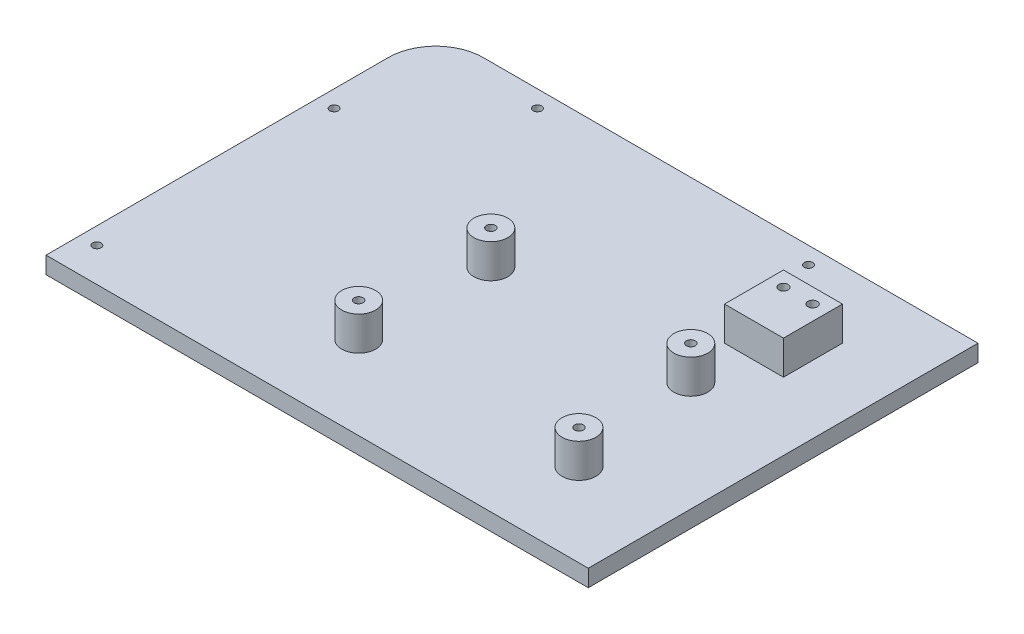
ISO-10303-21;
HEADER;
FILE_DESCRIPTION(('STEP AP214'),'2;1');
FILE_NAME('part.step','',(''),(''),'','','');
FILE_SCHEMA(('AUTOMOTIVE_DESIGN { 1 0 10303 214 1 1 1 1 }'));
ENDSEC;
DATA;
#1=APPLICATION_CONTEXT('core data for automotive mechanical design processes');
#2=APPLICATION_PROTOCOL_DEFINITION('international standard','automotive_design',2000,#1);
#3=PRODUCT_CONTEXT('',#1,'mechanical');
#4=PRODUCT('Part','Part','',(#3));
#5=PRODUCT_RELATED_PRODUCT_CATEGORY('part','',(#4));
#6=PRODUCT_DEFINITION_FORMATION('','',#4);
#7=PRODUCT_DEFINITION_CONTEXT('part definition',#1,'design');
#8=PRODUCT_DEFINITION('design','',#6,#7);
#9=PRODUCT_DEFINITION_SHAPE('','',#8);
#10=(LENGTH_UNIT() NAMED_UNIT(*) SI_UNIT(.MILLI.,.METRE.));
#11=(NAMED_UNIT(*) PLANE_ANGLE_UNIT() SI_UNIT($,.RADIAN.));
#12=(NAMED_UNIT(*) SI_UNIT($,.STERADIAN.) SOLID_ANGLE_UNIT());
#13=UNCERTAINTY_MEASURE_WITH_UNIT(LENGTH_MEASURE(1.E-05),#10,'distance_accuracy_value','');
#14=(GEOMETRIC_REPRESENTATION_CONTEXT(3) GLOBAL_UNCERTAINTY_ASSIGNED_CONTEXT((#13)) GLOBAL_UNIT_ASSIGNED_CONTEXT((#10,
#11,#12)) REPRESENTATION_CONTEXT('',''));
#15=CARTESIAN_POINT('',(0.,0.,0.));
#16=DIRECTION('',(0.,0.,1.));
#17=DIRECTION('',(1.,0.,0.));
#18=AXIS2_PLACEMENT_3D('',#15,#16,#17);
#19=CARTESIAN_POINT('',(17.78,6.35,-128.27));
#20=DIRECTION('',(0.,1.,0.));
#21=DIRECTION('',(0.,0.,1.));
#22=AXIS2_PLACEMENT_3D('',#19,#20,#21);
#23=PLANE('',#22);
#24=CARTESIAN_POINT('',(85.9336863697758,6.35,-31.242));
#25=DIRECTION('',(0.,1.,0.));
#26=DIRECTION('',(0.,0.,1.));
#27=AXIS2_PLACEMENT_3D('',#24,#25,#26);
#28=CIRCLE('',#27,6.35);
#29=CARTESIAN_POINT('',(85.9336863697758,6.35,-24.892));
#30=VERTEX_POINT('',#29);
#31=EDGE_CURVE('E169',#30,#30,#28,.T.);
#32=ORIENTED_EDGE('',*,*,#31,.F.);
#33=EDGE_LOOP('',(#32));
#34=FACE_BOUND('',#33,.T.);
#35=CARTESIAN_POINT('',(162.133686369776,6.35,-79.502));
#36=DIRECTION('',(0.,1.,0.));
#37=DIRECTION('',(0.,0.,1.));
#38=AXIS2_PLACEMENT_3D('',#35,#36,#37);
#39=CIRCLE('',#38,6.34999999999999);
#40=CARTESIAN_POINT('',(162.133686369776,6.35,-73.152));
#41=VERTEX_POINT('',#40);
#42=EDGE_CURVE('E173',#41,#41,#39,.T.);
#43=ORIENTED_EDGE('',*,*,#42,.F.);
#44=EDGE_LOOP('',(#43));
#45=FACE_BOUND('',#44,.T.);
#46=CARTESIAN_POINT('',(146.05,6.35,-139.7));
#47=DIRECTION('',(0.,1.,0.));
#48=DIRECTION('',(0.,0.,1.));
#49=AXIS2_PLACEMENT_3D('',#46,#47,#48);
#50=CIRCLE('',#49,1.58749999999999);
#51=CARTESIAN_POINT('',(146.05,6.35,-138.1125));
#52=VERTEX_POINT('',#51);
#53=EDGE_CURVE('E177',#52,#52,#50,.T.);
#54=ORIENTED_EDGE('',*,*,#53,.F.);
#55=EDGE_LOOP('',(#54));
#56=FACE_BOUND('',#55,.T.);
#57=CARTESIAN_POINT('',(6.35,6.35,-101.6));
#58=DIRECTION('',(0.,1.,0.));
#59=DIRECTION('',(0.,0.,1.));
#60=AXIS2_PLACEMENT_3D('',#57,#58,#59);
#61=CIRCLE('',#60,1.5875);
#62=CARTESIAN_POINT('',(6.35,6.35,-100.0125));
#63=VERTEX_POINT('',#62);
#64=EDGE_CURVE('E180',#63,#63,#61,.T.);
#65=ORIENTED_EDGE('',*,*,#64,.F.);
#66=EDGE_LOOP('',(#65));
#67=FACE_BOUND('',#66,.T.);
#68=DIRECTION('',(0.,0.,1.));
#69=VECTOR('',#68,1.);
#70=CARTESIAN_POINT('',(0.,6.35,0.));
#71=LINE('',#70,#69);
#72=CARTESIAN_POINT('',(0.,6.35,-128.27));
#73=VERTEX_POINT('',#72);
#74=CARTESIAN_POINT('',(0.,6.35,0.));
#75=VERTEX_POINT('',#74);
#76=EDGE_CURVE('E132',#73,#75,#71,.T.);
#77=ORIENTED_EDGE('',*,*,#76,.T.);
#78=DIRECTION('',(1.,0.,0.));
#79=VECTOR('',#78,1.);
#80=CARTESIAN_POINT('',(0.,6.35,0.));
#81=LINE('',#80,#79);
#82=CARTESIAN_POINT('',(203.2,6.35,0.));
#83=VERTEX_POINT('',#82);
#84=EDGE_CURVE('E90',#75,#83,#81,.T.);
#85=ORIENTED_EDGE('',*,*,#84,.T.);
#86=DIRECTION('',(0.,0.,-1.));
#87=VECTOR('',#86,1.);
#88=CARTESIAN_POINT('',(203.2,6.35,0.));
#89=LINE('',#88,#87);
#90=CARTESIAN_POINT('',(203.2,6.35,-146.05));
#91=VERTEX_POINT('',#90);
#92=EDGE_CURVE('E97',#83,#91,#89,.T.);
#93=ORIENTED_EDGE('',*,*,#92,.T.);
#94=DIRECTION('',(-1.,0.,0.));
#95=VECTOR('',#94,1.);
#96=CARTESIAN_POINT('',(17.7800000000001,6.35,-146.05));
#97=LINE('',#96,#95);
#98=CARTESIAN_POINT('',(17.7800000000001,6.35,-146.05));
#99=VERTEX_POINT('',#98);
#100=EDGE_CURVE('E101',#91,#99,#97,.T.);
#101=ORIENTED_EDGE('',*,*,#100,.T.);
#102=CARTESIAN_POINT('',(17.78,6.35,-128.27));
#103=DIRECTION('',(0.,1.,0.));
#104=DIRECTION('',(0.,0.,1.));
#105=AXIS2_PLACEMENT_3D('',#102,#103,#104);
#106=CIRCLE('',#105,17.78);
#107=EDGE_CURVE('E57',#99,#73,#106,.T.);
#108=ORIENTED_EDGE('',*,*,#107,.T.);
#109=EDGE_LOOP('',(#77,#85,#93,#101,#108));
#110=FACE_BOUND('',#109,.T.);
#111=CARTESIAN_POINT('',(6.35,6.35,-12.7));
#112=DIRECTION('',(0.,1.,0.));
#113=DIRECTION('',(0.,0.,1.));
#114=AXIS2_PLACEMENT_3D('',#111,#112,#113);
#115=CIRCLE('',#114,1.5875);
#116=CARTESIAN_POINT('',(6.35,6.35,-11.1125));
#117=VERTEX_POINT('',#116);
#118=EDGE_CURVE('E126',#117,#117,#115,.T.);
#119=ORIENTED_EDGE('',*,*,#118,.F.);
#120=EDGE_LOOP('',(#119));
#121=FACE_BOUND('',#120,.T.);
#122=CARTESIAN_POINT('',(44.45,6.35,-139.7));
#123=DIRECTION('',(0.,1.,0.));
#124=DIRECTION('',(0.,0.,1.));
#125=AXIS2_PLACEMENT_3D('',#122,#123,#124);
#126=CIRCLE('',#125,1.5875);
#127=CARTESIAN_POINT('',(44.45,6.35,-138.1125));
#128=VERTEX_POINT('',#127);
#129=EDGE_CURVE('E188',#128,#128,#126,.T.);
#130=ORIENTED_EDGE('',*,*,#129,.F.);
#131=EDGE_LOOP('',(#130));
#132=FACE_BOUND('',#131,.T.);
#133=DIRECTION('',(-1.,0.,0.));
#134=VECTOR('',#133,1.);
#135=CARTESIAN_POINT('',(177.8,6.35,-120.65));
#136=LINE('',#135,#134);
#137=CARTESIAN_POINT('',(177.8,6.35,-120.65));
#138=VERTEX_POINT('',#137);
#139=CARTESIAN_POINT('',(155.702,6.35,-120.65));
#140=VERTEX_POINT('',#139);
#141=EDGE_CURVE('E402',#138,#140,#136,.T.);
#142=ORIENTED_EDGE('',*,*,#141,.F.);
#143=DIRECTION('',(0.,0.,-1.));
#144=VECTOR('',#143,1.);
#145=CARTESIAN_POINT('',(177.8,6.35,-120.65));
#146=LINE('',#145,#144);
#147=CARTESIAN_POINT('',(177.8,6.35,-98.552));
#148=VERTEX_POINT('',#147);
#149=EDGE_CURVE('E438',#148,#138,#146,.T.);
#150=ORIENTED_EDGE('',*,*,#149,.F.);
#151=DIRECTION('',(1.,0.,0.));
#152=VECTOR('',#151,1.);
#153=CARTESIAN_POINT('',(177.8,6.35,-98.552));
#154=LINE('',#153,#152);
#155=CARTESIAN_POINT('',(155.702,6.35,-98.552));
#156=VERTEX_POINT('',#155);
#157=EDGE_CURVE('E443',#156,#148,#154,.T.);
#158=ORIENTED_EDGE('',*,*,#157,.F.);
#159=DIRECTION('',(0.,0.,1.));
#160=VECTOR('',#159,1.);
#161=CARTESIAN_POINT('',(155.702,6.35,-120.65));
#162=LINE('',#161,#160);
#163=EDGE_CURVE('E456',#140,#156,#162,.T.);
#164=ORIENTED_EDGE('',*,*,#163,.F.);
#165=EDGE_LOOP('',(#142,#150,#158,#164));
#166=FACE_BOUND('',#165,.T.);
#167=CARTESIAN_POINT('',(168.483686369776,6.35,-31.242));
#168=DIRECTION('',(0.,1.,0.));
#169=DIRECTION('',(0.,0.,1.));
#170=AXIS2_PLACEMENT_3D('',#167,#168,#169);
#171=CIRCLE('',#170,6.35);
#172=CARTESIAN_POINT('',(168.483686369776,6.35,-24.892));
#173=VERTEX_POINT('',#172);
#174=EDGE_CURVE('E406',#173,#173,#171,.T.);
#175=ORIENTED_EDGE('',*,*,#174,.F.);
#176=EDGE_LOOP('',(#175));
#177=FACE_BOUND('',#176,.T.);
#178=CARTESIAN_POINT('',(87.2036863697758,6.35,-79.502));
#179=DIRECTION('',(0.,1.,0.));
#180=DIRECTION('',(0.,0.,1.));
#181=AXIS2_PLACEMENT_3D('',#178,#179,#180);
#182=CIRCLE('',#181,6.34999999999999);
#183=CARTESIAN_POINT('',(87.2036863697758,6.35,-73.152));
#184=VERTEX_POINT('',#183);
#185=EDGE_CURVE('E409',#184,#184,#182,.T.);
#186=ORIENTED_EDGE('',*,*,#185,.F.);
#187=EDGE_LOOP('',(#186));
#188=FACE_BOUND('',#187,.T.);
#189=ADVANCED_FACE('F33',(#34,#45,#56,#67,#110,#121,#132,#166,#177,#188),#23,.T.);
#190=CARTESIAN_POINT('',(17.78,0.,-128.27));
#191=DIRECTION('',(0.,1.,0.));
#192=DIRECTION('',(0.,0.,1.));
#193=AXIS2_PLACEMENT_3D('',#190,#191,#192);
#194=PLANE('',#193);
#195=CARTESIAN_POINT('',(85.9336863697758,0.,-31.242));
#196=DIRECTION('',(0.,1.,0.));
#197=DIRECTION('',(0.,0.,1.));
#198=AXIS2_PLACEMENT_3D('',#195,#196,#197);
#199=CIRCLE('',#198,1.65100000000001);
#200=CARTESIAN_POINT('',(85.9336863697758,0.,-29.591));
#201=VERTEX_POINT('',#200);
#202=EDGE_CURVE('E505',#201,#201,#199,.T.);
#203=ORIENTED_EDGE('',*,*,#202,.T.);
#204=EDGE_LOOP('',(#203));
#205=FACE_BOUND('',#204,.T.);
#206=CARTESIAN_POINT('',(87.2036863697758,0.,-79.502));
#207=DIRECTION('',(0.,1.,0.));
#208=DIRECTION('',(0.,0.,1.));
#209=AXIS2_PLACEMENT_3D('',#206,#207,#208);
#210=CIRCLE('',#209,1.65100000000001);
#211=CARTESIAN_POINT('',(87.2036863697758,0.,-77.851));
#212=VERTEX_POINT('',#211);
#213=EDGE_CURVE('E499',#212,#212,#210,.T.);
#214=ORIENTED_EDGE('',*,*,#213,.T.);
#215=EDGE_LOOP('',(#214));
#216=FACE_BOUND('',#215,.T.);
#217=CARTESIAN_POINT('',(162.133686369776,0.,-79.502));
#218=DIRECTION('',(0.,1.,0.));
#219=DIRECTION('',(0.,0.,1.));
#220=AXIS2_PLACEMENT_3D('',#217,#218,#219);
#221=CIRCLE('',#220,1.65100000000002);
#222=CARTESIAN_POINT('',(162.133686369776,0.,-77.8509999999999));
#223=VERTEX_POINT('',#222);
#224=EDGE_CURVE('E493',#223,#223,#221,.T.);
#225=ORIENTED_EDGE('',*,*,#224,.T.);
#226=EDGE_LOOP('',(#225));
#227=FACE_BOUND('',#226,.T.);
#228=CARTESIAN_POINT('',(168.483686369776,0.,-31.242));
#229=DIRECTION('',(0.,1.,0.));
#230=DIRECTION('',(0.,0.,1.));
#231=AXIS2_PLACEMENT_3D('',#228,#229,#230);
#232=CIRCLE('',#231,1.65100000000002);
#233=CARTESIAN_POINT('',(168.483686369776,0.,-29.5909999999999));
#234=VERTEX_POINT('',#233);
#235=EDGE_CURVE('E417',#234,#234,#232,.T.);
#236=ORIENTED_EDGE('',*,*,#235,.T.);
#237=EDGE_LOOP('',(#236));
#238=FACE_BOUND('',#237,.T.);
#239=CARTESIAN_POINT('',(44.45,0.,-139.7));
#240=DIRECTION('',(0.,1.,0.));
#241=DIRECTION('',(0.,0.,1.));
#242=AXIS2_PLACEMENT_3D('',#239,#240,#241);
#243=CIRCLE('',#242,1.5875);
#244=CARTESIAN_POINT('',(44.45,0.,-138.1125));
#245=VERTEX_POINT('',#244);
#246=EDGE_CURVE('E191',#245,#245,#243,.T.);
#247=ORIENTED_EDGE('',*,*,#246,.T.);
#248=EDGE_LOOP('',(#247));
#249=FACE_BOUND('',#248,.T.);
#250=CARTESIAN_POINT('',(6.35,0.,-12.7));
#251=DIRECTION('',(0.,1.,0.));
#252=DIRECTION('',(0.,0.,1.));
#253=AXIS2_PLACEMENT_3D('',#250,#251,#252);
#254=CIRCLE('',#253,1.5875);
#255=CARTESIAN_POINT('',(6.35,0.,-11.1125));
#256=VERTEX_POINT('',#255);
#257=EDGE_CURVE('E182',#256,#256,#254,.T.);
#258=ORIENTED_EDGE('',*,*,#257,.T.);
#259=EDGE_LOOP('',(#258));
#260=FACE_BOUND('',#259,.T.);
#261=DIRECTION('',(0.,0.,1.));
#262=VECTOR('',#261,1.);
#263=CARTESIAN_POINT('',(0.,0.,0.));
#264=LINE('',#263,#262);
#265=CARTESIAN_POINT('',(0.,0.,-128.27));
#266=VERTEX_POINT('',#265);
#267=CARTESIAN_POINT('',(0.,0.,0.));
#268=VERTEX_POINT('',#267);
#269=EDGE_CURVE('E122',#266,#268,#264,.T.);
#270=ORIENTED_EDGE('',*,*,#269,.F.);
#271=CARTESIAN_POINT('',(17.78,0.,-128.27));
#272=DIRECTION('',(0.,1.,0.));
#273=DIRECTION('',(0.,0.,1.));
#274=AXIS2_PLACEMENT_3D('',#271,#272,#273);
#275=CIRCLE('',#274,17.78);
#276=CARTESIAN_POINT('',(17.7800000000001,0.,-146.05));
#277=VERTEX_POINT('',#276);
#278=EDGE_CURVE('E81',#277,#266,#275,.T.);
#279=ORIENTED_EDGE('',*,*,#278,.F.);
#280=DIRECTION('',(-1.,0.,0.));
#281=VECTOR('',#280,1.);
#282=CARTESIAN_POINT('',(17.7800000000001,0.,-146.05));
#283=LINE('',#282,#281);
#284=CARTESIAN_POINT('',(203.2,0.,-146.05));
#285=VERTEX_POINT('',#284);
#286=EDGE_CURVE('E129',#285,#277,#283,.T.);
#287=ORIENTED_EDGE('',*,*,#286,.F.);
#288=DIRECTION('',(0.,0.,-1.));
#289=VECTOR('',#288,1.);
#290=CARTESIAN_POINT('',(203.2,0.,0.));
#291=LINE('',#290,#289);
#292=CARTESIAN_POINT('',(203.2,0.,0.));
#293=VERTEX_POINT('',#292);
#294=EDGE_CURVE('E110',#293,#285,#291,.T.);
#295=ORIENTED_EDGE('',*,*,#294,.F.);
#296=DIRECTION('',(1.,0.,0.));
#297=VECTOR('',#296,1.);
#298=CARTESIAN_POINT('',(0.,0.,0.));
#299=LINE('',#298,#297);
#300=EDGE_CURVE('E125',#268,#293,#299,.T.);
#301=ORIENTED_EDGE('',*,*,#300,.F.);
#302=EDGE_LOOP('',(#270,#279,#287,#295,#301));
#303=FACE_BOUND('',#302,.T.);
#304=CARTESIAN_POINT('',(6.35,0.,-101.6));
#305=DIRECTION('',(0.,1.,0.));
#306=DIRECTION('',(0.,0.,1.));
#307=AXIS2_PLACEMENT_3D('',#304,#305,#306);
#308=CIRCLE('',#307,1.5875);
#309=CARTESIAN_POINT('',(6.35,0.,-100.0125));
#310=VERTEX_POINT('',#309);
#311=EDGE_CURVE('E183',#310,#310,#308,.T.);
#312=ORIENTED_EDGE('',*,*,#311,.T.);
#313=EDGE_LOOP('',(#312));
#314=FACE_BOUND('',#313,.T.);
#315=CARTESIAN_POINT('',(146.05,0.,-139.7));
#316=DIRECTION('',(0.,1.,0.));
#317=DIRECTION('',(0.,0.,1.));
#318=AXIS2_PLACEMENT_3D('',#315,#316,#317);
#319=CIRCLE('',#318,1.58749999999999);
#320=CARTESIAN_POINT('',(146.05,0.,-138.1125));
#321=VERTEX_POINT('',#320);
#322=EDGE_CURVE('E377',#321,#321,#319,.T.);
#323=ORIENTED_EDGE('',*,*,#322,.T.);
#324=EDGE_LOOP('',(#323));
#325=FACE_BOUND('',#324,.T.);
#326=ADVANCED_FACE('F159',(#205,#216,#227,#238,#249,#260,#303,#314,#325),#194,.F.);
#327=CARTESIAN_POINT('',(0.,6.35,0.));
#328=DIRECTION('',(1.,0.,0.));
#329=DIRECTION('',(0.,0.,-1.));
#330=AXIS2_PLACEMENT_3D('',#327,#328,#329);
#331=PLANE('',#330);
#332=ORIENTED_EDGE('',*,*,#269,.T.);
#333=DIRECTION('',(0.,-1.,0.));
#334=VECTOR('',#333,1.);
#335=CARTESIAN_POINT('',(0.,6.35,0.));
#336=LINE('',#335,#334);
#337=EDGE_CURVE('E136',#75,#268,#336,.T.);
#338=ORIENTED_EDGE('',*,*,#337,.F.);
#339=ORIENTED_EDGE('',*,*,#76,.F.);
#340=DIRECTION('',(0.,-1.,0.));
#341=VECTOR('',#340,1.);
#342=CARTESIAN_POINT('',(0.,6.35,-128.27));
#343=LINE('',#342,#341);
#344=EDGE_CURVE('E118',#73,#266,#343,.T.);
#345=ORIENTED_EDGE('',*,*,#344,.T.);
#346=EDGE_LOOP('',(#332,#338,#339,#345));
#347=FACE_BOUND('',#346,.T.);
#348=ADVANCED_FACE('F35',(#347),#331,.F.);
#349=CARTESIAN_POINT('',(0.,6.35,0.));
#350=DIRECTION('',(0.,0.,-1.));
#351=DIRECTION('',(-1.,0.,0.));
#352=AXIS2_PLACEMENT_3D('',#349,#350,#351);
#353=PLANE('',#352);
#354=ORIENTED_EDGE('',*,*,#300,.T.);
#355=DIRECTION('',(0.,-1.,0.));
#356=VECTOR('',#355,1.);
#357=CARTESIAN_POINT('',(203.2,6.35,0.));
#358=LINE('',#357,#356);
#359=EDGE_CURVE('E113',#83,#293,#358,.T.);
#360=ORIENTED_EDGE('',*,*,#359,.F.);
#361=ORIENTED_EDGE('',*,*,#84,.F.);
#362=ORIENTED_EDGE('',*,*,#337,.T.);
#363=EDGE_LOOP('',(#354,#360,#361,#362));
#364=FACE_BOUND('',#363,.T.);
#365=ADVANCED_FACE('F200',(#364),#353,.F.);
#366=CARTESIAN_POINT('',(203.2,6.35,0.));
#367=DIRECTION('',(-1.,0.,0.));
#368=DIRECTION('',(0.,0.,1.));
#369=AXIS2_PLACEMENT_3D('',#366,#367,#368);
#370=PLANE('',#369);
#371=ORIENTED_EDGE('',*,*,#294,.T.);
#372=DIRECTION('',(0.,-1.,0.));
#373=VECTOR('',#372,1.);
#374=CARTESIAN_POINT('',(203.2,6.35,-146.05));
#375=LINE('',#374,#373);
#376=EDGE_CURVE('E107',#91,#285,#375,.T.);
#377=ORIENTED_EDGE('',*,*,#376,.F.);
#378=ORIENTED_EDGE('',*,*,#92,.F.);
#379=ORIENTED_EDGE('',*,*,#359,.T.);
#380=EDGE_LOOP('',(#371,#377,#378,#379));
#381=FACE_BOUND('',#380,.T.);
#382=ADVANCED_FACE('F108',(#381),#370,.F.);
#383=CARTESIAN_POINT('',(17.7800000000001,6.35,-146.05));
#384=DIRECTION('',(0.,0.,1.));
#385=DIRECTION('',(1.,0.,0.));
#386=AXIS2_PLACEMENT_3D('',#383,#384,#385);
#387=PLANE('',#386);
#388=ORIENTED_EDGE('',*,*,#286,.T.);
#389=DIRECTION('',(0.,-1.,0.));
#390=VECTOR('',#389,1.);
#391=CARTESIAN_POINT('',(17.7800000000001,6.35,-146.05));
#392=LINE('',#391,#390);
#393=EDGE_CURVE('E114',#99,#277,#392,.T.);
#394=ORIENTED_EDGE('',*,*,#393,.F.);
#395=ORIENTED_EDGE('',*,*,#100,.F.);
#396=ORIENTED_EDGE('',*,*,#376,.T.);
#397=EDGE_LOOP('',(#388,#394,#395,#396));
#398=FACE_BOUND('',#397,.T.);
#399=ADVANCED_FACE('F116',(#398),#387,.F.);
#400=CARTESIAN_POINT('',(17.78,6.35,-128.27));
#401=DIRECTION('',(0.,-1.,0.));
#402=DIRECTION('',(0.,0.,-1.));
#403=AXIS2_PLACEMENT_3D('',#400,#401,#402);
#404=CYLINDRICAL_SURFACE('',#403,17.78);
#405=ORIENTED_EDGE('',*,*,#278,.T.);
#406=ORIENTED_EDGE('',*,*,#344,.F.);
#407=ORIENTED_EDGE('',*,*,#107,.F.);
#408=ORIENTED_EDGE('',*,*,#393,.T.);
#409=EDGE_LOOP('',(#405,#406,#407,#408));
#410=FACE_BOUND('',#409,.T.);
#411=ADVANCED_FACE('F203',(#410),#404,.T.);
#412=CARTESIAN_POINT('',(6.35,6.35,-12.7));
#413=DIRECTION('',(0.,-1.,0.));
#414=DIRECTION('',(0.,0.,-1.));
#415=AXIS2_PLACEMENT_3D('',#412,#413,#414);
#416=CYLINDRICAL_SURFACE('',#415,1.5875);
#417=ORIENTED_EDGE('',*,*,#118,.T.);
#418=EDGE_LOOP('',(#417));
#419=FACE_BOUND('',#418,.T.);
#420=ORIENTED_EDGE('',*,*,#257,.F.);
#421=EDGE_LOOP('',(#420));
#422=FACE_BOUND('',#421,.T.);
#423=ADVANCED_FACE('F205',(#419,#422),#416,.F.);
#424=CARTESIAN_POINT('',(6.35,6.35,-101.6));
#425=DIRECTION('',(0.,-1.,0.));
#426=DIRECTION('',(0.,0.,-1.));
#427=AXIS2_PLACEMENT_3D('',#424,#425,#426);
#428=CYLINDRICAL_SURFACE('',#427,1.5875);
#429=ORIENTED_EDGE('',*,*,#64,.T.);
#430=EDGE_LOOP('',(#429));
#431=FACE_BOUND('',#430,.T.);
#432=ORIENTED_EDGE('',*,*,#311,.F.);
#433=EDGE_LOOP('',(#432));
#434=FACE_BOUND('',#433,.T.);
#435=ADVANCED_FACE('F211',(#431,#434),#428,.F.);
#436=CARTESIAN_POINT('',(44.45,6.35,-139.7));
#437=DIRECTION('',(0.,-1.,0.));
#438=DIRECTION('',(0.,0.,-1.));
#439=AXIS2_PLACEMENT_3D('',#436,#437,#438);
#440=CYLINDRICAL_SURFACE('',#439,1.5875);
#441=ORIENTED_EDGE('',*,*,#129,.T.);
#442=EDGE_LOOP('',(#441));
#443=FACE_BOUND('',#442,.T.);
#444=ORIENTED_EDGE('',*,*,#246,.F.);
#445=EDGE_LOOP('',(#444));
#446=FACE_BOUND('',#445,.T.);
#447=ADVANCED_FACE('F364',(#443,#446),#440,.F.);
#448=CARTESIAN_POINT('',(146.05,6.35,-139.7));
#449=DIRECTION('',(0.,-1.,0.));
#450=DIRECTION('',(0.,0.,-1.));
#451=AXIS2_PLACEMENT_3D('',#448,#449,#450);
#452=CYLINDRICAL_SURFACE('',#451,1.58749999999999);
#453=ORIENTED_EDGE('',*,*,#53,.T.);
#454=EDGE_LOOP('',(#453));
#455=FACE_BOUND('',#454,.T.);
#456=ORIENTED_EDGE('',*,*,#322,.F.);
#457=EDGE_LOOP('',(#456));
#458=FACE_BOUND('',#457,.T.);
#459=ADVANCED_FACE('F347',(#455,#458),#452,.F.);
#460=CARTESIAN_POINT('',(0.,19.05,0.));
#461=DIRECTION('',(0.,-1.,0.));
#462=DIRECTION('',(0.,0.,-1.));
#463=AXIS2_PLACEMENT_3D('',#460,#461,#462);
#464=PLANE('',#463);
#465=CARTESIAN_POINT('',(172.212,19.05,-115.062));
#466=DIRECTION('',(0.,1.,0.));
#467=DIRECTION('',(0.,0.,1.));
#468=AXIS2_PLACEMENT_3D('',#465,#466,#467);
#469=CIRCLE('',#468,1.778);
#470=CARTESIAN_POINT('',(172.212,19.05,-113.284));
#471=VERTEX_POINT('',#470);
#472=EDGE_CURVE('E435',#471,#471,#469,.T.);
#473=ORIENTED_EDGE('',*,*,#472,.F.);
#474=EDGE_LOOP('',(#473));
#475=FACE_BOUND('',#474,.T.);
#476=DIRECTION('',(0.,0.,-1.));
#477=VECTOR('',#476,1.);
#478=CARTESIAN_POINT('',(177.8,19.05,-120.65));
#479=LINE('',#478,#477);
#480=CARTESIAN_POINT('',(177.8,19.05,-98.552));
#481=VERTEX_POINT('',#480);
#482=CARTESIAN_POINT('',(177.8,19.05,-120.65));
#483=VERTEX_POINT('',#482);
#484=EDGE_CURVE('E439',#481,#483,#479,.T.);
#485=ORIENTED_EDGE('',*,*,#484,.T.);
#486=DIRECTION('',(-1.,0.,0.));
#487=VECTOR('',#486,1.);
#488=CARTESIAN_POINT('',(177.8,19.05,-120.65));
#489=LINE('',#488,#487);
#490=CARTESIAN_POINT('',(155.702,19.05,-120.65));
#491=VERTEX_POINT('',#490);
#492=EDGE_CURVE('E442',#483,#491,#489,.T.);
#493=ORIENTED_EDGE('',*,*,#492,.T.);
#494=DIRECTION('',(0.,0.,1.));
#495=VECTOR('',#494,1.);
#496=CARTESIAN_POINT('',(155.702,19.05,-120.65));
#497=LINE('',#496,#495);
#498=CARTESIAN_POINT('',(155.702,19.05,-98.552));
#499=VERTEX_POINT('',#498);
#500=EDGE_CURVE('E446',#491,#499,#497,.T.);
#501=ORIENTED_EDGE('',*,*,#500,.T.);
#502=DIRECTION('',(1.,0.,0.));
#503=VECTOR('',#502,1.);
#504=CARTESIAN_POINT('',(177.8,19.05,-98.552));
#505=LINE('',#504,#503);
#506=EDGE_CURVE('E449',#499,#481,#505,.T.);
#507=ORIENTED_EDGE('',*,*,#506,.T.);
#508=EDGE_LOOP('',(#485,#493,#501,#507));
#509=FACE_BOUND('',#508,.T.);
#510=CARTESIAN_POINT('',(161.29,19.05,-115.062));
#511=DIRECTION('',(0.,1.,0.));
#512=DIRECTION('',(0.,0.,1.));
#513=AXIS2_PLACEMENT_3D('',#510,#511,#512);
#514=CIRCLE('',#513,1.778);
#515=CARTESIAN_POINT('',(161.29,19.05,-113.284));
#516=VERTEX_POINT('',#515);
#517=EDGE_CURVE('E431',#516,#516,#514,.T.);
#518=ORIENTED_EDGE('',*,*,#517,.F.);
#519=EDGE_LOOP('',(#518));
#520=FACE_BOUND('',#519,.T.);
#521=ADVANCED_FACE('F343',(#475,#509,#520),#464,.F.);
#522=CARTESIAN_POINT('',(177.8,19.05,-120.65));
#523=DIRECTION('',(-1.,0.,0.));
#524=DIRECTION('',(0.,0.,1.));
#525=AXIS2_PLACEMENT_3D('',#522,#523,#524);
#526=PLANE('',#525);
#527=ORIENTED_EDGE('',*,*,#149,.T.);
#528=DIRECTION('',(0.,-1.,0.));
#529=VECTOR('',#528,1.);
#530=CARTESIAN_POINT('',(177.8,19.05,-120.65));
#531=LINE('',#530,#529);
#532=EDGE_CURVE('E379',#483,#138,#531,.T.);
#533=ORIENTED_EDGE('',*,*,#532,.F.);
#534=ORIENTED_EDGE('',*,*,#484,.F.);
#535=DIRECTION('',(0.,-1.,0.));
#536=VECTOR('',#535,1.);
#537=CARTESIAN_POINT('',(177.8,19.05,-98.552));
#538=LINE('',#537,#536);
#539=EDGE_CURVE('E452',#481,#148,#538,.T.);
#540=ORIENTED_EDGE('',*,*,#539,.T.);
#541=EDGE_LOOP('',(#527,#533,#534,#540));
#542=FACE_BOUND('',#541,.T.);
#543=ADVANCED_FACE('F346',(#542),#526,.F.);
#544=CARTESIAN_POINT('',(177.8,19.05,-120.65));
#545=DIRECTION('',(0.,0.,1.));
#546=DIRECTION('',(1.,0.,0.));
#547=AXIS2_PLACEMENT_3D('',#544,#545,#546);
#548=PLANE('',#547);
#549=ORIENTED_EDGE('',*,*,#141,.T.);
#550=DIRECTION('',(0.,-1.,0.));
#551=VECTOR('',#550,1.);
#552=CARTESIAN_POINT('',(155.702,19.05,-120.65));
#553=LINE('',#552,#551);
#554=EDGE_CURVE('E383',#491,#140,#553,.T.);
#555=ORIENTED_EDGE('',*,*,#554,.F.);
#556=ORIENTED_EDGE('',*,*,#492,.F.);
#557=ORIENTED_EDGE('',*,*,#532,.T.);
#558=EDGE_LOOP('',(#549,#555,#556,#557));
#559=FACE_BOUND('',#558,.T.);
#560=ADVANCED_FACE('F354',(#559),#548,.F.);
#561=CARTESIAN_POINT('',(155.702,19.05,-120.65));
#562=DIRECTION('',(1.,0.,0.));
#563=DIRECTION('',(0.,0.,-1.));
#564=AXIS2_PLACEMENT_3D('',#561,#562,#563);
#565=PLANE('',#564);
#566=ORIENTED_EDGE('',*,*,#163,.T.);
#567=DIRECTION('',(0.,-1.,0.));
#568=VECTOR('',#567,1.);
#569=CARTESIAN_POINT('',(155.702,19.05,-98.552));
#570=LINE('',#569,#568);
#571=EDGE_CURVE('E48',#499,#156,#570,.T.);
#572=ORIENTED_EDGE('',*,*,#571,.F.);
#573=ORIENTED_EDGE('',*,*,#500,.F.);
#574=ORIENTED_EDGE('',*,*,#554,.T.);
#575=EDGE_LOOP('',(#566,#572,#573,#574));
#576=FACE_BOUND('',#575,.T.);
#577=ADVANCED_FACE('F351',(#576),#565,.F.);
#578=CARTESIAN_POINT('',(177.8,19.05,-98.552));
#579=DIRECTION('',(0.,0.,-1.));
#580=DIRECTION('',(-1.,0.,0.));
#581=AXIS2_PLACEMENT_3D('',#578,#579,#580);
#582=PLANE('',#581);
#583=ORIENTED_EDGE('',*,*,#157,.T.);
#584=ORIENTED_EDGE('',*,*,#539,.F.);
#585=ORIENTED_EDGE('',*,*,#506,.F.);
#586=ORIENTED_EDGE('',*,*,#571,.T.);
#587=EDGE_LOOP('',(#583,#584,#585,#586));
#588=FACE_BOUND('',#587,.T.);
#589=ADVANCED_FACE('F341',(#588),#582,.F.);
#590=CARTESIAN_POINT('',(172.212,19.05,-115.062));
#591=DIRECTION('',(0.,-1.,0.));
#592=DIRECTION('',(0.,0.,-1.));
#593=AXIS2_PLACEMENT_3D('',#590,#591,#592);
#594=CYLINDRICAL_SURFACE('',#593,1.778);
#595=ORIENTED_EDGE('',*,*,#472,.T.);
#596=EDGE_LOOP('',(#595));
#597=FACE_BOUND('',#596,.T.);
#598=CARTESIAN_POINT('',(172.212,6.35,-115.062));
#599=DIRECTION('',(0.,1.,0.));
#600=DIRECTION('',(0.,0.,1.));
#601=AXIS2_PLACEMENT_3D('',#598,#599,#600);
#602=CIRCLE('',#601,1.778);
#603=CARTESIAN_POINT('',(172.212,6.35,-113.284));
#604=VERTEX_POINT('',#603);
#605=EDGE_CURVE('E11',#604,#604,#602,.F.);
#606=ORIENTED_EDGE('',*,*,#605,.T.);
#607=EDGE_LOOP('',(#606));
#608=FACE_BOUND('',#607,.T.);
#609=ADVANCED_FACE('F153',(#597,#608),#594,.F.);
#610=CARTESIAN_POINT('',(161.29,19.05,-115.062));
#611=DIRECTION('',(0.,-1.,0.));
#612=DIRECTION('',(0.,0.,-1.));
#613=AXIS2_PLACEMENT_3D('',#610,#611,#612);
#614=CYLINDRICAL_SURFACE('',#613,1.778);
#615=ORIENTED_EDGE('',*,*,#517,.T.);
#616=EDGE_LOOP('',(#615));
#617=FACE_BOUND('',#616,.T.);
#618=CARTESIAN_POINT('',(161.29,6.35,-115.062));
#619=DIRECTION('',(0.,1.,0.));
#620=DIRECTION('',(0.,0.,1.));
#621=AXIS2_PLACEMENT_3D('',#618,#619,#620);
#622=CIRCLE('',#621,1.778);
#623=CARTESIAN_POINT('',(161.29,6.35,-113.284));
#624=VERTEX_POINT('',#623);
#625=EDGE_CURVE('E41',#624,#624,#622,.F.);
#626=ORIENTED_EDGE('',*,*,#625,.T.);
#627=EDGE_LOOP('',(#626));
#628=FACE_BOUND('',#627,.T.);
#629=ADVANCED_FACE('F140',(#617,#628),#614,.F.);
#630=ORIENTED_EDGE('',*,*,#625,.F.);
#631=EDGE_LOOP('',(#630));
#632=FACE_BOUND('',#631,.T.);
#633=ADVANCED_FACE('F142',(#632),#23,.T.);
#634=ORIENTED_EDGE('',*,*,#605,.F.);
#635=EDGE_LOOP('',(#634));
#636=FACE_BOUND('',#635,.T.);
#637=ADVANCED_FACE('F144',(#636),#23,.T.);
#638=CARTESIAN_POINT('',(162.133686369776,19.05,-79.502));
#639=DIRECTION('',(0.,-1.,0.));
#640=DIRECTION('',(0.,0.,-1.));
#641=AXIS2_PLACEMENT_3D('',#638,#639,#640);
#642=CYLINDRICAL_SURFACE('',#641,6.34999999999999);
#643=CARTESIAN_POINT('',(162.133686369776,19.05,-79.502));
#644=DIRECTION('',(0.,1.,0.));
#645=DIRECTION('',(0.,0.,1.));
#646=AXIS2_PLACEMENT_3D('',#643,#644,#645);
#647=CIRCLE('',#646,6.34999999999999);
#648=CARTESIAN_POINT('',(162.133686369776,19.05,-73.152));
#649=VERTEX_POINT('',#648);
#650=EDGE_CURVE('E428',#649,#649,#647,.T.);
#651=ORIENTED_EDGE('',*,*,#650,.F.);
#652=EDGE_LOOP('',(#651));
#653=FACE_BOUND('',#652,.T.);
#654=ORIENTED_EDGE('',*,*,#42,.T.);
#655=EDGE_LOOP('',(#654));
#656=FACE_BOUND('',#655,.T.);
#657=ADVANCED_FACE('F150',(#653,#656),#642,.T.);
#658=CARTESIAN_POINT('',(162.133686369776,19.05,-79.502));
#659=DIRECTION('',(0.,1.,0.));
#660=DIRECTION('',(0.,0.,1.));
#661=AXIS2_PLACEMENT_3D('',#658,#659,#660);
#662=PLANE('',#661);
#663=CARTESIAN_POINT('',(162.133686369776,19.05,-79.502));
#664=DIRECTION('',(0.,1.,0.));
#665=DIRECTION('',(0.,0.,1.));
#666=AXIS2_PLACEMENT_3D('',#663,#664,#665);
#667=CIRCLE('',#666,1.65100000000002);
#668=CARTESIAN_POINT('',(162.133686369776,19.05,-77.8509999999999));
#669=VERTEX_POINT('',#668);
#670=EDGE_CURVE('E496',#669,#669,#667,.T.);
#671=ORIENTED_EDGE('',*,*,#670,.F.);
#672=EDGE_LOOP('',(#671));
#673=FACE_BOUND('',#672,.T.);
#674=ORIENTED_EDGE('',*,*,#650,.T.);
#675=EDGE_LOOP('',(#674));
#676=FACE_BOUND('',#675,.T.);
#677=ADVANCED_FACE('F241',(#673,#676),#662,.T.);
#678=CARTESIAN_POINT('',(168.483686369776,19.05,-31.242));
#679=DIRECTION('',(0.,-1.,0.));
#680=DIRECTION('',(0.,0.,-1.));
#681=AXIS2_PLACEMENT_3D('',#678,#679,#680);
#682=CYLINDRICAL_SURFACE('',#681,6.35);
#683=CARTESIAN_POINT('',(168.483686369776,19.05,-31.242));
#684=DIRECTION('',(0.,1.,0.));
#685=DIRECTION('',(0.,0.,1.));
#686=AXIS2_PLACEMENT_3D('',#683,#684,#685);
#687=CIRCLE('',#686,6.35);
#688=CARTESIAN_POINT('',(168.483686369776,19.05,-24.892));
#689=VERTEX_POINT('',#688);
#690=EDGE_CURVE('E423',#689,#689,#687,.T.);
#691=ORIENTED_EDGE('',*,*,#690,.F.);
#692=EDGE_LOOP('',(#691));
#693=FACE_BOUND('',#692,.T.);
#694=ORIENTED_EDGE('',*,*,#174,.T.);
#695=EDGE_LOOP('',(#694));
#696=FACE_BOUND('',#695,.T.);
#697=ADVANCED_FACE('F246',(#693,#696),#682,.T.);
#698=CARTESIAN_POINT('',(168.483686369776,19.05,-31.242));
#699=DIRECTION('',(0.,1.,0.));
#700=DIRECTION('',(0.,0.,1.));
#701=AXIS2_PLACEMENT_3D('',#698,#699,#700);
#702=PLANE('',#701);
#703=CARTESIAN_POINT('',(168.483686369776,19.05,-31.242));
#704=DIRECTION('',(0.,1.,0.));
#705=DIRECTION('',(0.,0.,1.));
#706=AXIS2_PLACEMENT_3D('',#703,#704,#705);
#707=CIRCLE('',#706,1.65100000000002);
#708=CARTESIAN_POINT('',(168.483686369776,19.05,-29.5909999999999));
#709=VERTEX_POINT('',#708);
#710=EDGE_CURVE('E420',#709,#709,#707,.T.);
#711=ORIENTED_EDGE('',*,*,#710,.F.);
#712=EDGE_LOOP('',(#711));
#713=FACE_BOUND('',#712,.T.);
#714=ORIENTED_EDGE('',*,*,#690,.T.);
#715=EDGE_LOOP('',(#714));
#716=FACE_BOUND('',#715,.T.);
#717=ADVANCED_FACE('F256',(#713,#716),#702,.T.);
#718=CARTESIAN_POINT('',(85.9336863697758,19.05,-31.242));
#719=DIRECTION('',(0.,-1.,0.));
#720=DIRECTION('',(0.,0.,-1.));
#721=AXIS2_PLACEMENT_3D('',#718,#719,#720);
#722=CYLINDRICAL_SURFACE('',#721,6.35);
#723=CARTESIAN_POINT('',(85.9336863697758,19.05,-31.242));
#724=DIRECTION('',(0.,1.,0.));
#725=DIRECTION('',(0.,0.,1.));
#726=AXIS2_PLACEMENT_3D('',#723,#724,#725);
#727=CIRCLE('',#726,6.35);
#728=CARTESIAN_POINT('',(85.9336863697758,19.05,-24.892));
#729=VERTEX_POINT('',#728);
#730=EDGE_CURVE('E411',#729,#729,#727,.T.);
#731=ORIENTED_EDGE('',*,*,#730,.F.);
#732=EDGE_LOOP('',(#731));
#733=FACE_BOUND('',#732,.T.);
#734=ORIENTED_EDGE('',*,*,#31,.T.);
#735=EDGE_LOOP('',(#734));
#736=FACE_BOUND('',#735,.T.);
#737=ADVANCED_FACE('F261',(#733,#736),#722,.T.);
#738=CARTESIAN_POINT('',(85.9336863697758,19.05,-31.242));
#739=DIRECTION('',(0.,1.,0.));
#740=DIRECTION('',(0.,0.,1.));
#741=AXIS2_PLACEMENT_3D('',#738,#739,#740);
#742=PLANE('',#741);
#743=CARTESIAN_POINT('',(85.9336863697758,19.05,-31.242));
#744=DIRECTION('',(0.,1.,0.));
#745=DIRECTION('',(0.,0.,1.));
#746=AXIS2_PLACEMENT_3D('',#743,#744,#745);
#747=CIRCLE('',#746,1.65100000000001);
#748=CARTESIAN_POINT('',(85.9336863697758,19.05,-29.591));
#749=VERTEX_POINT('',#748);
#750=EDGE_CURVE('E508',#749,#749,#747,.T.);
#751=ORIENTED_EDGE('',*,*,#750,.F.);
#752=EDGE_LOOP('',(#751));
#753=FACE_BOUND('',#752,.T.);
#754=ORIENTED_EDGE('',*,*,#730,.T.);
#755=EDGE_LOOP('',(#754));
#756=FACE_BOUND('',#755,.T.);
#757=ADVANCED_FACE('F269',(#753,#756),#742,.T.);
#758=CARTESIAN_POINT('',(87.2036863697758,19.05,-79.502));
#759=DIRECTION('',(0.,-1.,0.));
#760=DIRECTION('',(0.,0.,-1.));
#761=AXIS2_PLACEMENT_3D('',#758,#759,#760);
#762=CYLINDRICAL_SURFACE('',#761,6.34999999999999);
#763=CARTESIAN_POINT('',(87.2036863697758,19.05,-79.502));
#764=DIRECTION('',(0.,1.,0.));
#765=DIRECTION('',(0.,0.,1.));
#766=AXIS2_PLACEMENT_3D('',#763,#764,#765);
#767=CIRCLE('',#766,6.34999999999999);
#768=CARTESIAN_POINT('',(87.2036863697758,19.05,-73.152));
#769=VERTEX_POINT('',#768);
#770=EDGE_CURVE('E412',#769,#769,#767,.T.);
#771=ORIENTED_EDGE('',*,*,#770,.F.);
#772=EDGE_LOOP('',(#771));
#773=FACE_BOUND('',#772,.T.);
#774=ORIENTED_EDGE('',*,*,#185,.T.);
#775=EDGE_LOOP('',(#774));
#776=FACE_BOUND('',#775,.T.);
#777=ADVANCED_FACE('F236',(#773,#776),#762,.T.);
#778=CARTESIAN_POINT('',(87.2036863697758,19.05,-79.502));
#779=DIRECTION('',(0.,1.,0.));
#780=DIRECTION('',(0.,0.,1.));
#781=AXIS2_PLACEMENT_3D('',#778,#779,#780);
#782=PLANE('',#781);
#783=CARTESIAN_POINT('',(87.2036863697758,19.05,-79.502));
#784=DIRECTION('',(0.,1.,0.));
#785=DIRECTION('',(0.,0.,1.));
#786=AXIS2_PLACEMENT_3D('',#783,#784,#785);
#787=CIRCLE('',#786,1.65100000000001);
#788=CARTESIAN_POINT('',(87.2036863697758,19.05,-77.851));
#789=VERTEX_POINT('',#788);
#790=EDGE_CURVE('E502',#789,#789,#787,.T.);
#791=ORIENTED_EDGE('',*,*,#790,.F.);
#792=EDGE_LOOP('',(#791));
#793=FACE_BOUND('',#792,.T.);
#794=ORIENTED_EDGE('',*,*,#770,.T.);
#795=EDGE_LOOP('',(#794));
#796=FACE_BOUND('',#795,.T.);
#797=ADVANCED_FACE('F279',(#793,#796),#782,.T.);
#798=CARTESIAN_POINT('',(168.483686369776,0.,-31.242));
#799=DIRECTION('',(0.,1.,0.));
#800=DIRECTION('',(0.,0.,1.));
#801=AXIS2_PLACEMENT_3D('',#798,#799,#800);
#802=CYLINDRICAL_SURFACE('',#801,1.65100000000002);
#803=ORIENTED_EDGE('',*,*,#235,.F.);
#804=EDGE_LOOP('',(#803));
#805=FACE_BOUND('',#804,.T.);
#806=ORIENTED_EDGE('',*,*,#710,.T.);
#807=EDGE_LOOP('',(#806));
#808=FACE_BOUND('',#807,.T.);
#809=ADVANCED_FACE('F284',(#805,#808),#802,.F.);
#810=CARTESIAN_POINT('',(162.133686369776,0.,-79.502));
#811=DIRECTION('',(0.,1.,0.));
#812=DIRECTION('',(0.,0.,1.));
#813=AXIS2_PLACEMENT_3D('',#810,#811,#812);
#814=CYLINDRICAL_SURFACE('',#813,1.65100000000002);
#815=ORIENTED_EDGE('',*,*,#224,.F.);
#816=EDGE_LOOP('',(#815));
#817=FACE_BOUND('',#816,.T.);
#818=ORIENTED_EDGE('',*,*,#670,.T.);
#819=EDGE_LOOP('',(#818));
#820=FACE_BOUND('',#819,.T.);
#821=ADVANCED_FACE('F294',(#817,#820),#814,.F.);
#822=CARTESIAN_POINT('',(87.2036863697758,0.,-79.502));
#823=DIRECTION('',(0.,1.,0.));
#824=DIRECTION('',(0.,0.,1.));
#825=AXIS2_PLACEMENT_3D('',#822,#823,#824);
#826=CYLINDRICAL_SURFACE('',#825,1.65100000000001);
#827=ORIENTED_EDGE('',*,*,#213,.F.);
#828=EDGE_LOOP('',(#827));
#829=FACE_BOUND('',#828,.T.);
#830=ORIENTED_EDGE('',*,*,#790,.T.);
#831=EDGE_LOOP('',(#830));
#832=FACE_BOUND('',#831,.T.);
#833=ADVANCED_FACE('F304',(#829,#832),#826,.F.);
#834=CARTESIAN_POINT('',(85.9336863697758,0.,-31.242));
#835=DIRECTION('',(0.,1.,0.));
#836=DIRECTION('',(0.,0.,1.));
#837=AXIS2_PLACEMENT_3D('',#834,#835,#836);
#838=CYLINDRICAL_SURFACE('',#837,1.65100000000001);
#839=ORIENTED_EDGE('',*,*,#202,.F.);
#840=EDGE_LOOP('',(#839));
#841=FACE_BOUND('',#840,.T.);
#842=ORIENTED_EDGE('',*,*,#750,.T.);
#843=EDGE_LOOP('',(#842));
#844=FACE_BOUND('',#843,.T.);
#845=ADVANCED_FACE('F314',(#841,#844),#838,.F.);
#846=CLOSED_SHELL('',(#189,#326,#348,#365,#382,#399,#411,#423,#435,#447,#459,#521,#543,#560,
#577,#589,#609,#629,#633,#637,#657,#677,#697,#717,#737,#757,#777,#797,#809,#821,#833,#845));
#847=MANIFOLD_SOLID_BREP('B2',#846);
#848=ADVANCED_BREP_SHAPE_REPRESENTATION('',(#18,#847),#14);
#849=SHAPE_DEFINITION_REPRESENTATION(#9,#848);
ENDSEC;
END-ISO-10303-21;
